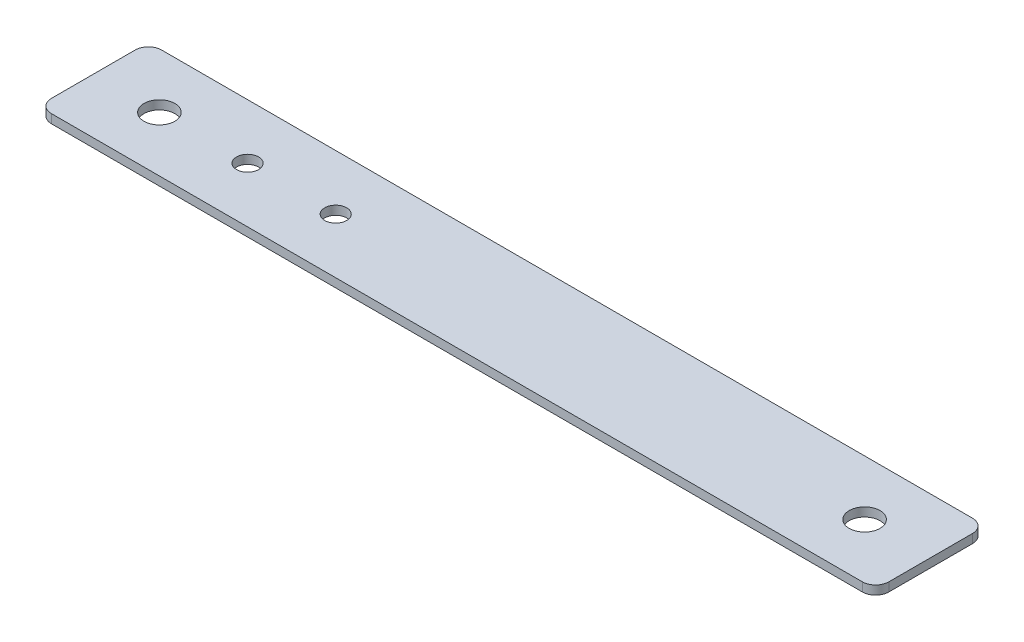
ISO-10303-21;
HEADER;
FILE_DESCRIPTION(('STEP AP214'),'2;1');
FILE_NAME('part.step','',(''),(''),'','','');
FILE_SCHEMA(('AUTOMOTIVE_DESIGN { 1 0 10303 214 1 1 1 1 }'));
ENDSEC;
DATA;
#1=APPLICATION_CONTEXT('core data for automotive mechanical design processes');
#2=APPLICATION_PROTOCOL_DEFINITION('international standard','automotive_design',2000,#1);
#3=PRODUCT_CONTEXT('',#1,'mechanical');
#4=PRODUCT('Part','Part','',(#3));
#5=PRODUCT_RELATED_PRODUCT_CATEGORY('part','',(#4));
#6=PRODUCT_DEFINITION_FORMATION('','',#4);
#7=PRODUCT_DEFINITION_CONTEXT('part definition',#1,'design');
#8=PRODUCT_DEFINITION('design','',#6,#7);
#9=PRODUCT_DEFINITION_SHAPE('','',#8);
#10=(LENGTH_UNIT() NAMED_UNIT(*) SI_UNIT(.MILLI.,.METRE.));
#11=(NAMED_UNIT(*) PLANE_ANGLE_UNIT() SI_UNIT($,.RADIAN.));
#12=(NAMED_UNIT(*) SI_UNIT($,.STERADIAN.) SOLID_ANGLE_UNIT());
#13=UNCERTAINTY_MEASURE_WITH_UNIT(LENGTH_MEASURE(1.E-05),#10,'distance_accuracy_value','');
#14=(GEOMETRIC_REPRESENTATION_CONTEXT(3) GLOBAL_UNCERTAINTY_ASSIGNED_CONTEXT((#13)) GLOBAL_UNIT_ASSIGNED_CONTEXT((#10,
#11,#12)) REPRESENTATION_CONTEXT('',''));
#15=CARTESIAN_POINT('',(0.,0.,0.));
#16=DIRECTION('',(0.,0.,1.));
#17=DIRECTION('',(1.,0.,0.));
#18=AXIS2_PLACEMENT_3D('',#15,#16,#17);
#19=CARTESIAN_POINT('',(-92.,2.,9.50000000000001));
#20=DIRECTION('',(0.,-1.,0.));
#21=DIRECTION('',(0.,0.,-1.));
#22=AXIS2_PLACEMENT_3D('',#19,#20,#21);
#23=CYLINDRICAL_SURFACE('',#22,3.);
#24=CARTESIAN_POINT('',(-92.,0.,9.50000000000001));
#25=DIRECTION('',(0.,1.,0.));
#26=DIRECTION('',(0.,0.,-1.));
#27=AXIS2_PLACEMENT_3D('',#24,#25,#26);
#28=CIRCLE('',#27,3.);
#29=CARTESIAN_POINT('',(-95.,0.,9.49999999999999));
#30=VERTEX_POINT('',#29);
#31=CARTESIAN_POINT('',(-92.,0.,12.5));
#32=VERTEX_POINT('',#31);
#33=EDGE_CURVE('E146',#30,#32,#28,.T.);
#34=ORIENTED_EDGE('',*,*,#33,.T.);
#35=DIRECTION('',(0.,-1.,0.));
#36=VECTOR('',#35,1.);
#37=CARTESIAN_POINT('',(-92.,2.,12.5));
#38=LINE('',#37,#36);
#39=CARTESIAN_POINT('',(-92.,2.,12.5));
#40=VERTEX_POINT('',#39);
#41=EDGE_CURVE('E11',#40,#32,#38,.T.);
#42=ORIENTED_EDGE('',*,*,#41,.F.);
#43=CARTESIAN_POINT('',(-92.,2.,9.50000000000001));
#44=DIRECTION('',(0.,1.,0.));
#45=DIRECTION('',(0.,0.,-1.));
#46=AXIS2_PLACEMENT_3D('',#43,#44,#45);
#47=CIRCLE('',#46,3.);
#48=CARTESIAN_POINT('',(-95.,2.,9.49999999999999));
#49=VERTEX_POINT('',#48);
#50=EDGE_CURVE('E169',#49,#40,#47,.T.);
#51=ORIENTED_EDGE('',*,*,#50,.F.);
#52=DIRECTION('',(0.,-1.,0.));
#53=VECTOR('',#52,1.);
#54=CARTESIAN_POINT('',(-95.,2.,9.49999999999999));
#55=LINE('',#54,#53);
#56=EDGE_CURVE('E142',#49,#30,#55,.T.);
#57=ORIENTED_EDGE('',*,*,#56,.T.);
#58=EDGE_LOOP('',(#34,#42,#51,#57));
#59=FACE_BOUND('',#58,.T.);
#60=ADVANCED_FACE('F44',(#59),#23,.T.);
#61=CARTESIAN_POINT('',(92.,2.,12.5));
#62=DIRECTION('',(0.,0.,-1.));
#63=DIRECTION('',(-1.,0.,0.));
#64=AXIS2_PLACEMENT_3D('',#61,#62,#63);
#65=PLANE('',#64);
#66=DIRECTION('',(1.,0.,0.));
#67=VECTOR('',#66,1.);
#68=CARTESIAN_POINT('',(92.,0.,12.5));
#69=LINE('',#68,#67);
#70=CARTESIAN_POINT('',(92.,0.,12.5));
#71=VERTEX_POINT('',#70);
#72=EDGE_CURVE('E150',#32,#71,#69,.T.);
#73=ORIENTED_EDGE('',*,*,#72,.T.);
#74=DIRECTION('',(0.,-1.,0.));
#75=VECTOR('',#74,1.);
#76=CARTESIAN_POINT('',(92.,2.,12.5));
#77=LINE('',#76,#75);
#78=CARTESIAN_POINT('',(92.,2.,12.5));
#79=VERTEX_POINT('',#78);
#80=EDGE_CURVE('E53',#79,#71,#77,.T.);
#81=ORIENTED_EDGE('',*,*,#80,.F.);
#82=DIRECTION('',(1.,0.,0.));
#83=VECTOR('',#82,1.);
#84=CARTESIAN_POINT('',(92.,2.,12.5));
#85=LINE('',#84,#83);
#86=EDGE_CURVE('E104',#40,#79,#85,.T.);
#87=ORIENTED_EDGE('',*,*,#86,.F.);
#88=ORIENTED_EDGE('',*,*,#41,.T.);
#89=EDGE_LOOP('',(#73,#81,#87,#88));
#90=FACE_BOUND('',#89,.T.);
#91=ADVANCED_FACE('F277',(#90),#65,.F.);
#92=CARTESIAN_POINT('',(92.,2.,9.49999999999999));
#93=DIRECTION('',(0.,-1.,0.));
#94=DIRECTION('',(0.,0.,-1.));
#95=AXIS2_PLACEMENT_3D('',#92,#93,#94);
#96=CYLINDRICAL_SURFACE('',#95,3.);
#97=CARTESIAN_POINT('',(92.,0.,9.49999999999999));
#98=DIRECTION('',(0.,1.,0.));
#99=DIRECTION('',(0.,0.,1.));
#100=AXIS2_PLACEMENT_3D('',#97,#98,#99);
#101=CIRCLE('',#100,3.);
#102=CARTESIAN_POINT('',(95.,0.,9.49999999999997));
#103=VERTEX_POINT('',#102);
#104=EDGE_CURVE('E154',#71,#103,#101,.T.);
#105=ORIENTED_EDGE('',*,*,#104,.T.);
#106=DIRECTION('',(0.,-1.,0.));
#107=VECTOR('',#106,1.);
#108=CARTESIAN_POINT('',(95.,2.,9.49999999999997));
#109=LINE('',#108,#107);
#110=CARTESIAN_POINT('',(95.,2.,9.49999999999997));
#111=VERTEX_POINT('',#110);
#112=EDGE_CURVE('E180',#111,#103,#109,.T.);
#113=ORIENTED_EDGE('',*,*,#112,.F.);
#114=CARTESIAN_POINT('',(92.,2.,9.49999999999999));
#115=DIRECTION('',(0.,1.,0.));
#116=DIRECTION('',(0.,0.,1.));
#117=AXIS2_PLACEMENT_3D('',#114,#115,#116);
#118=CIRCLE('',#117,3.);
#119=EDGE_CURVE('E191',#79,#111,#118,.T.);
#120=ORIENTED_EDGE('',*,*,#119,.F.);
#121=ORIENTED_EDGE('',*,*,#80,.T.);
#122=EDGE_LOOP('',(#105,#113,#120,#121));
#123=FACE_BOUND('',#122,.T.);
#124=ADVANCED_FACE('F189',(#123),#96,.T.);
#125=CARTESIAN_POINT('',(95.,2.,9.49999999999997));
#126=DIRECTION('',(-1.,0.,0.));
#127=DIRECTION('',(0.,0.,1.));
#128=AXIS2_PLACEMENT_3D('',#125,#126,#127);
#129=PLANE('',#128);
#130=DIRECTION('',(0.,0.,-1.));
#131=VECTOR('',#130,1.);
#132=CARTESIAN_POINT('',(95.,0.,9.49999999999997));
#133=LINE('',#132,#131);
#134=CARTESIAN_POINT('',(95.,0.,-9.49999999999999));
#135=VERTEX_POINT('',#134);
#136=EDGE_CURVE('E157',#103,#135,#133,.T.);
#137=ORIENTED_EDGE('',*,*,#136,.T.);
#138=DIRECTION('',(0.,-1.,0.));
#139=VECTOR('',#138,1.);
#140=CARTESIAN_POINT('',(95.,2.,-9.49999999999999));
#141=LINE('',#140,#139);
#142=CARTESIAN_POINT('',(95.,2.,-9.49999999999999));
#143=VERTEX_POINT('',#142);
#144=EDGE_CURVE('E176',#143,#135,#141,.T.);
#145=ORIENTED_EDGE('',*,*,#144,.F.);
#146=DIRECTION('',(0.,0.,-1.));
#147=VECTOR('',#146,1.);
#148=CARTESIAN_POINT('',(95.,2.,9.49999999999997));
#149=LINE('',#148,#147);
#150=EDGE_CURVE('E204',#111,#143,#149,.T.);
#151=ORIENTED_EDGE('',*,*,#150,.F.);
#152=ORIENTED_EDGE('',*,*,#112,.T.);
#153=EDGE_LOOP('',(#137,#145,#151,#152));
#154=FACE_BOUND('',#153,.T.);
#155=ADVANCED_FACE('F199',(#154),#129,.F.);
#156=CARTESIAN_POINT('',(92.,2.,-9.50000000000001));
#157=DIRECTION('',(0.,-1.,0.));
#158=DIRECTION('',(0.,0.,-1.));
#159=AXIS2_PLACEMENT_3D('',#156,#157,#158);
#160=CYLINDRICAL_SURFACE('',#159,3.);
#161=CARTESIAN_POINT('',(92.,0.,-9.50000000000001));
#162=DIRECTION('',(0.,1.,0.));
#163=DIRECTION('',(0.,0.,1.));
#164=AXIS2_PLACEMENT_3D('',#161,#162,#163);
#165=CIRCLE('',#164,3.);
#166=CARTESIAN_POINT('',(92.,0.,-12.5));
#167=VERTEX_POINT('',#166);
#168=EDGE_CURVE('E160',#135,#167,#165,.T.);
#169=ORIENTED_EDGE('',*,*,#168,.T.);
#170=DIRECTION('',(0.,-1.,0.));
#171=VECTOR('',#170,1.);
#172=CARTESIAN_POINT('',(92.,2.,-12.5));
#173=LINE('',#172,#171);
#174=CARTESIAN_POINT('',(92.,2.,-12.5));
#175=VERTEX_POINT('',#174);
#176=EDGE_CURVE('E134',#175,#167,#173,.T.);
#177=ORIENTED_EDGE('',*,*,#176,.F.);
#178=CARTESIAN_POINT('',(92.,2.,-9.50000000000001));
#179=DIRECTION('',(0.,1.,0.));
#180=DIRECTION('',(0.,0.,1.));
#181=AXIS2_PLACEMENT_3D('',#178,#179,#180);
#182=CIRCLE('',#181,3.);
#183=EDGE_CURVE('E123',#143,#175,#182,.T.);
#184=ORIENTED_EDGE('',*,*,#183,.F.);
#185=ORIENTED_EDGE('',*,*,#144,.T.);
#186=EDGE_LOOP('',(#169,#177,#184,#185));
#187=FACE_BOUND('',#186,.T.);
#188=ADVANCED_FACE('F202',(#187),#160,.T.);
#189=CARTESIAN_POINT('',(92.,2.,-12.5));
#190=DIRECTION('',(0.,0.,1.));
#191=DIRECTION('',(1.,0.,0.));
#192=AXIS2_PLACEMENT_3D('',#189,#190,#191);
#193=PLANE('',#192);
#194=DIRECTION('',(-1.,0.,0.));
#195=VECTOR('',#194,1.);
#196=CARTESIAN_POINT('',(92.,0.,-12.5));
#197=LINE('',#196,#195);
#198=CARTESIAN_POINT('',(-92.,0.,-12.5));
#199=VERTEX_POINT('',#198);
#200=EDGE_CURVE('E132',#167,#199,#197,.T.);
#201=ORIENTED_EDGE('',*,*,#200,.T.);
#202=DIRECTION('',(0.,-1.,0.));
#203=VECTOR('',#202,1.);
#204=CARTESIAN_POINT('',(-92.,2.,-12.5));
#205=LINE('',#204,#203);
#206=CARTESIAN_POINT('',(-92.,2.,-12.5));
#207=VERTEX_POINT('',#206);
#208=EDGE_CURVE('E129',#207,#199,#205,.T.);
#209=ORIENTED_EDGE('',*,*,#208,.F.);
#210=DIRECTION('',(-1.,0.,0.));
#211=VECTOR('',#210,1.);
#212=CARTESIAN_POINT('',(92.,2.,-12.5));
#213=LINE('',#212,#211);
#214=EDGE_CURVE('E117',#175,#207,#213,.T.);
#215=ORIENTED_EDGE('',*,*,#214,.F.);
#216=ORIENTED_EDGE('',*,*,#176,.T.);
#217=EDGE_LOOP('',(#201,#209,#215,#216));
#218=FACE_BOUND('',#217,.T.);
#219=ADVANCED_FACE('F130',(#218),#193,.F.);
#220=CARTESIAN_POINT('',(-92.,2.,-9.49999999999999));
#221=DIRECTION('',(0.,-1.,0.));
#222=DIRECTION('',(0.,0.,-1.));
#223=AXIS2_PLACEMENT_3D('',#220,#221,#222);
#224=CYLINDRICAL_SURFACE('',#223,3.);
#225=CARTESIAN_POINT('',(-92.,0.,-9.49999999999999));
#226=DIRECTION('',(0.,1.,0.));
#227=DIRECTION('',(0.,0.,1.));
#228=AXIS2_PLACEMENT_3D('',#225,#226,#227);
#229=CIRCLE('',#228,3.);
#230=CARTESIAN_POINT('',(-95.,0.,-9.49999999999997));
#231=VERTEX_POINT('',#230);
#232=EDGE_CURVE('E90',#199,#231,#229,.T.);
#233=ORIENTED_EDGE('',*,*,#232,.T.);
#234=DIRECTION('',(0.,-1.,0.));
#235=VECTOR('',#234,1.);
#236=CARTESIAN_POINT('',(-95.,2.,-9.49999999999997));
#237=LINE('',#236,#235);
#238=CARTESIAN_POINT('',(-95.,2.,-9.49999999999997));
#239=VERTEX_POINT('',#238);
#240=EDGE_CURVE('E135',#239,#231,#237,.T.);
#241=ORIENTED_EDGE('',*,*,#240,.F.);
#242=CARTESIAN_POINT('',(-92.,2.,-9.49999999999999));
#243=DIRECTION('',(0.,1.,0.));
#244=DIRECTION('',(0.,0.,1.));
#245=AXIS2_PLACEMENT_3D('',#242,#243,#244);
#246=CIRCLE('',#245,3.);
#247=EDGE_CURVE('E121',#207,#239,#246,.T.);
#248=ORIENTED_EDGE('',*,*,#247,.F.);
#249=ORIENTED_EDGE('',*,*,#208,.T.);
#250=EDGE_LOOP('',(#233,#241,#248,#249));
#251=FACE_BOUND('',#250,.T.);
#252=ADVANCED_FACE('F137',(#251),#224,.T.);
#253=CARTESIAN_POINT('',(-95.,2.,9.49999999999999));
#254=DIRECTION('',(1.,0.,0.));
#255=DIRECTION('',(0.,0.,-1.));
#256=AXIS2_PLACEMENT_3D('',#253,#254,#255);
#257=PLANE('',#256);
#258=DIRECTION('',(0.,0.,1.));
#259=VECTOR('',#258,1.);
#260=CARTESIAN_POINT('',(-95.,0.,9.49999999999999));
#261=LINE('',#260,#259);
#262=EDGE_CURVE('E96',#231,#30,#261,.T.);
#263=ORIENTED_EDGE('',*,*,#262,.T.);
#264=ORIENTED_EDGE('',*,*,#56,.F.);
#265=DIRECTION('',(0.,0.,1.));
#266=VECTOR('',#265,1.);
#267=CARTESIAN_POINT('',(-95.,2.,9.49999999999999));
#268=LINE('',#267,#266);
#269=EDGE_CURVE('E61',#239,#49,#268,.T.);
#270=ORIENTED_EDGE('',*,*,#269,.F.);
#271=ORIENTED_EDGE('',*,*,#240,.T.);
#272=EDGE_LOOP('',(#263,#264,#270,#271));
#273=FACE_BOUND('',#272,.T.);
#274=ADVANCED_FACE('F252',(#273),#257,.F.);
#275=CARTESIAN_POINT('',(-92.,2.,9.50000000000001));
#276=DIRECTION('',(0.,-1.,0.));
#277=DIRECTION('',(0.,0.,-1.));
#278=AXIS2_PLACEMENT_3D('',#275,#276,#277);
#279=PLANE('',#278);
#280=CARTESIAN_POINT('',(-60.,2.,0.));
#281=DIRECTION('',(0.,1.,0.));
#282=DIRECTION('',(0.,0.,1.));
#283=AXIS2_PLACEMENT_3D('',#280,#281,#282);
#284=CIRCLE('',#283,2.5);
#285=CARTESIAN_POINT('',(-60.,2.,2.5));
#286=VERTEX_POINT('',#285);
#287=EDGE_CURVE('E242',#286,#286,#284,.T.);
#288=ORIENTED_EDGE('',*,*,#287,.F.);
#289=EDGE_LOOP('',(#288));
#290=FACE_BOUND('',#289,.T.);
#291=CARTESIAN_POINT('',(-40.,2.,0.));
#292=DIRECTION('',(0.,1.,0.));
#293=DIRECTION('',(0.,0.,1.));
#294=AXIS2_PLACEMENT_3D('',#291,#292,#293);
#295=CIRCLE('',#294,2.5);
#296=CARTESIAN_POINT('',(-40.,2.,2.5));
#297=VERTEX_POINT('',#296);
#298=EDGE_CURVE('E234',#297,#297,#295,.T.);
#299=ORIENTED_EDGE('',*,*,#298,.F.);
#300=EDGE_LOOP('',(#299));
#301=FACE_BOUND('',#300,.T.);
#302=CARTESIAN_POINT('',(-80.,2.,0.));
#303=DIRECTION('',(0.,1.,0.));
#304=DIRECTION('',(0.,0.,1.));
#305=AXIS2_PLACEMENT_3D('',#302,#303,#304);
#306=CIRCLE('',#305,3.5);
#307=CARTESIAN_POINT('',(-80.,2.,3.5));
#308=VERTEX_POINT('',#307);
#309=EDGE_CURVE('E226',#308,#308,#306,.T.);
#310=ORIENTED_EDGE('',*,*,#309,.F.);
#311=EDGE_LOOP('',(#310));
#312=FACE_BOUND('',#311,.T.);
#313=CARTESIAN_POINT('',(80.,2.,0.));
#314=DIRECTION('',(0.,1.,0.));
#315=DIRECTION('',(0.,0.,1.));
#316=AXIS2_PLACEMENT_3D('',#313,#314,#315);
#317=CIRCLE('',#316,3.5);
#318=CARTESIAN_POINT('',(80.,2.,3.5));
#319=VERTEX_POINT('',#318);
#320=EDGE_CURVE('E218',#319,#319,#317,.T.);
#321=ORIENTED_EDGE('',*,*,#320,.F.);
#322=EDGE_LOOP('',(#321));
#323=FACE_BOUND('',#322,.T.);
#324=ORIENTED_EDGE('',*,*,#50,.T.);
#325=ORIENTED_EDGE('',*,*,#86,.T.);
#326=ORIENTED_EDGE('',*,*,#119,.T.);
#327=ORIENTED_EDGE('',*,*,#150,.T.);
#328=ORIENTED_EDGE('',*,*,#183,.T.);
#329=ORIENTED_EDGE('',*,*,#214,.T.);
#330=ORIENTED_EDGE('',*,*,#247,.T.);
#331=ORIENTED_EDGE('',*,*,#269,.T.);
#332=EDGE_LOOP('',(#324,#325,#326,#327,#328,#329,#330,#331));
#333=FACE_BOUND('',#332,.T.);
#334=ADVANCED_FACE('F119',(#290,#301,#312,#323,#333),#279,.F.);
#335=CARTESIAN_POINT('',(-92.,0.,9.50000000000001));
#336=DIRECTION('',(0.,-1.,0.));
#337=DIRECTION('',(0.,0.,-1.));
#338=AXIS2_PLACEMENT_3D('',#335,#336,#337);
#339=PLANE('',#338);
#340=CARTESIAN_POINT('',(-60.,0.,0.));
#341=DIRECTION('',(0.,1.,0.));
#342=DIRECTION('',(0.,0.,1.));
#343=AXIS2_PLACEMENT_3D('',#340,#341,#342);
#344=CIRCLE('',#343,2.5);
#345=CARTESIAN_POINT('',(-60.,0.,2.5));
#346=VERTEX_POINT('',#345);
#347=EDGE_CURVE('E238',#346,#346,#344,.T.);
#348=ORIENTED_EDGE('',*,*,#347,.T.);
#349=EDGE_LOOP('',(#348));
#350=FACE_BOUND('',#349,.T.);
#351=CARTESIAN_POINT('',(-40.,0.,0.));
#352=DIRECTION('',(0.,1.,0.));
#353=DIRECTION('',(0.,0.,1.));
#354=AXIS2_PLACEMENT_3D('',#351,#352,#353);
#355=CIRCLE('',#354,2.5);
#356=CARTESIAN_POINT('',(-40.,0.,2.5));
#357=VERTEX_POINT('',#356);
#358=EDGE_CURVE('E230',#357,#357,#355,.T.);
#359=ORIENTED_EDGE('',*,*,#358,.T.);
#360=EDGE_LOOP('',(#359));
#361=FACE_BOUND('',#360,.T.);
#362=CARTESIAN_POINT('',(-80.,0.,0.));
#363=DIRECTION('',(0.,1.,0.));
#364=DIRECTION('',(0.,0.,1.));
#365=AXIS2_PLACEMENT_3D('',#362,#363,#364);
#366=CIRCLE('',#365,3.5);
#367=CARTESIAN_POINT('',(-80.,0.,3.5));
#368=VERTEX_POINT('',#367);
#369=EDGE_CURVE('E222',#368,#368,#366,.T.);
#370=ORIENTED_EDGE('',*,*,#369,.T.);
#371=EDGE_LOOP('',(#370));
#372=FACE_BOUND('',#371,.T.);
#373=CARTESIAN_POINT('',(80.,0.,0.));
#374=DIRECTION('',(0.,1.,0.));
#375=DIRECTION('',(0.,0.,1.));
#376=AXIS2_PLACEMENT_3D('',#373,#374,#375);
#377=CIRCLE('',#376,3.5);
#378=CARTESIAN_POINT('',(80.,0.,3.5));
#379=VERTEX_POINT('',#378);
#380=EDGE_CURVE('E151',#379,#379,#377,.T.);
#381=ORIENTED_EDGE('',*,*,#380,.T.);
#382=EDGE_LOOP('',(#381));
#383=FACE_BOUND('',#382,.T.);
#384=ORIENTED_EDGE('',*,*,#33,.F.);
#385=ORIENTED_EDGE('',*,*,#262,.F.);
#386=ORIENTED_EDGE('',*,*,#232,.F.);
#387=ORIENTED_EDGE('',*,*,#200,.F.);
#388=ORIENTED_EDGE('',*,*,#168,.F.);
#389=ORIENTED_EDGE('',*,*,#136,.F.);
#390=ORIENTED_EDGE('',*,*,#104,.F.);
#391=ORIENTED_EDGE('',*,*,#72,.F.);
#392=EDGE_LOOP('',(#384,#385,#386,#387,#388,#389,#390,#391));
#393=FACE_BOUND('',#392,.T.);
#394=ADVANCED_FACE('F195',(#350,#361,#372,#383,#393),#339,.T.);
#395=CARTESIAN_POINT('',(80.,2.,0.));
#396=DIRECTION('',(0.,1.,0.));
#397=DIRECTION('',(0.,0.,1.));
#398=AXIS2_PLACEMENT_3D('',#395,#396,#397);
#399=CYLINDRICAL_SURFACE('',#398,3.5);
#400=ORIENTED_EDGE('',*,*,#380,.F.);
#401=EDGE_LOOP('',(#400));
#402=FACE_BOUND('',#401,.T.);
#403=ORIENTED_EDGE('',*,*,#320,.T.);
#404=EDGE_LOOP('',(#403));
#405=FACE_BOUND('',#404,.T.);
#406=ADVANCED_FACE('F260',(#402,#405),#399,.F.);
#407=CARTESIAN_POINT('',(-80.,2.,0.));
#408=DIRECTION('',(0.,1.,0.));
#409=DIRECTION('',(0.,0.,1.));
#410=AXIS2_PLACEMENT_3D('',#407,#408,#409);
#411=CYLINDRICAL_SURFACE('',#410,3.5);
#412=ORIENTED_EDGE('',*,*,#369,.F.);
#413=EDGE_LOOP('',(#412));
#414=FACE_BOUND('',#413,.T.);
#415=ORIENTED_EDGE('',*,*,#309,.T.);
#416=EDGE_LOOP('',(#415));
#417=FACE_BOUND('',#416,.T.);
#418=ADVANCED_FACE('F262',(#414,#417),#411,.F.);
#419=CARTESIAN_POINT('',(-40.,2.,0.));
#420=DIRECTION('',(0.,1.,0.));
#421=DIRECTION('',(0.,0.,1.));
#422=AXIS2_PLACEMENT_3D('',#419,#420,#421);
#423=CYLINDRICAL_SURFACE('',#422,2.5);
#424=ORIENTED_EDGE('',*,*,#358,.F.);
#425=EDGE_LOOP('',(#424));
#426=FACE_BOUND('',#425,.T.);
#427=ORIENTED_EDGE('',*,*,#298,.T.);
#428=EDGE_LOOP('',(#427));
#429=FACE_BOUND('',#428,.T.);
#430=ADVANCED_FACE('F269',(#426,#429),#423,.F.);
#431=CARTESIAN_POINT('',(-60.,2.,0.));
#432=DIRECTION('',(0.,1.,0.));
#433=DIRECTION('',(0.,0.,1.));
#434=AXIS2_PLACEMENT_3D('',#431,#432,#433);
#435=CYLINDRICAL_SURFACE('',#434,2.5);
#436=ORIENTED_EDGE('',*,*,#347,.F.);
#437=EDGE_LOOP('',(#436));
#438=FACE_BOUND('',#437,.T.);
#439=ORIENTED_EDGE('',*,*,#287,.T.);
#440=EDGE_LOOP('',(#439));
#441=FACE_BOUND('',#440,.T.);
#442=ADVANCED_FACE('F248',(#438,#441),#435,.F.);
#443=CLOSED_SHELL('',(#60,#91,#124,#155,#188,#219,#252,#274,#334,#394,#406,#418,#430,#442));
#444=MANIFOLD_SOLID_BREP('B2',#443);
#445=ADVANCED_BREP_SHAPE_REPRESENTATION('',(#18,#444),#14);
#446=SHAPE_DEFINITION_REPRESENTATION(#9,#445);
ENDSEC;
END-ISO-10303-21;
